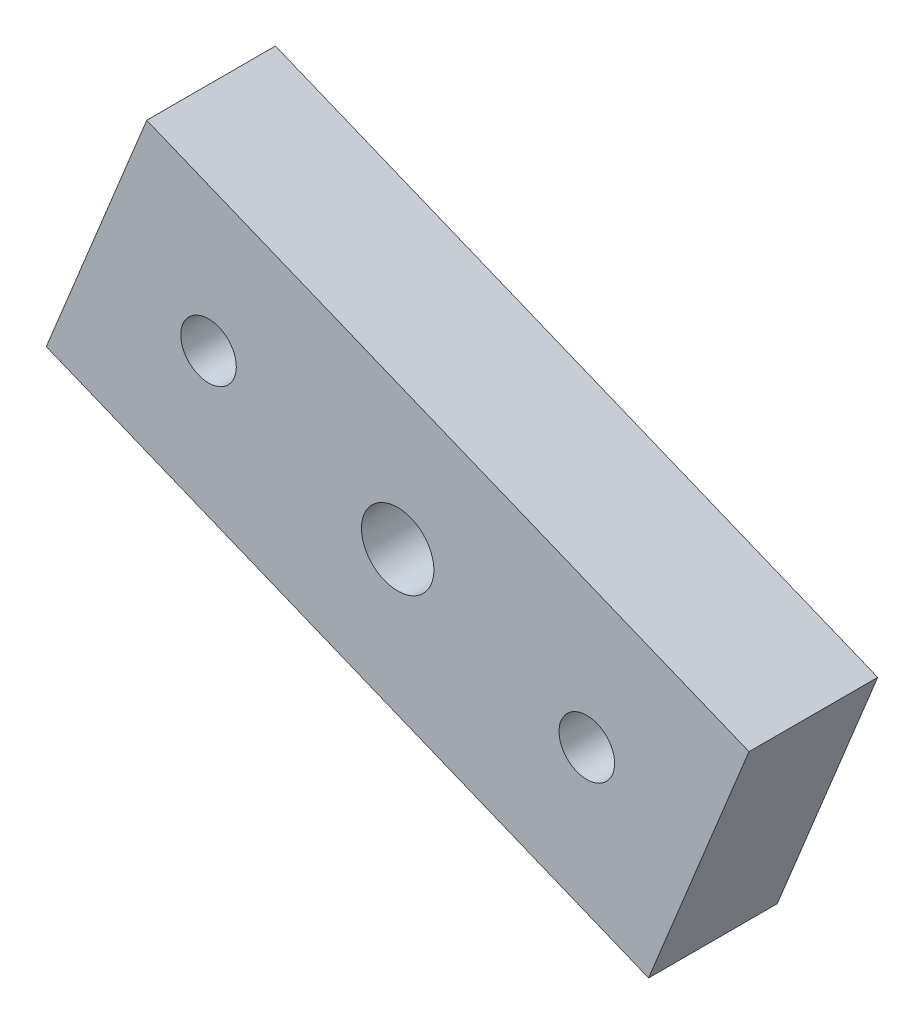
ISO-10303-21;
HEADER;
FILE_DESCRIPTION(('STEP AP214'),'2;1');
FILE_NAME('part.step','',(''),(''),'','','');
FILE_SCHEMA(('AUTOMOTIVE_DESIGN { 1 0 10303 214 1 1 1 1 }'));
ENDSEC;
DATA;
#1=APPLICATION_CONTEXT('core data for automotive mechanical design processes');
#2=APPLICATION_PROTOCOL_DEFINITION('international standard','automotive_design',2000,#1);
#3=PRODUCT_CONTEXT('',#1,'mechanical');
#4=PRODUCT('Part','Part','',(#3));
#5=PRODUCT_RELATED_PRODUCT_CATEGORY('part','',(#4));
#6=PRODUCT_DEFINITION_FORMATION('','',#4);
#7=PRODUCT_DEFINITION_CONTEXT('part definition',#1,'design');
#8=PRODUCT_DEFINITION('design','',#6,#7);
#9=PRODUCT_DEFINITION_SHAPE('','',#8);
#10=(LENGTH_UNIT() NAMED_UNIT(*) SI_UNIT(.MILLI.,.METRE.));
#11=(NAMED_UNIT(*) PLANE_ANGLE_UNIT() SI_UNIT($,.RADIAN.));
#12=(NAMED_UNIT(*) SI_UNIT($,.STERADIAN.) SOLID_ANGLE_UNIT());
#13=UNCERTAINTY_MEASURE_WITH_UNIT(LENGTH_MEASURE(1.E-05),#10,'distance_accuracy_value','');
#14=(GEOMETRIC_REPRESENTATION_CONTEXT(3) GLOBAL_UNCERTAINTY_ASSIGNED_CONTEXT((#13)) GLOBAL_UNIT_ASSIGNED_CONTEXT((#10,
#11,#12)) REPRESENTATION_CONTEXT('',''));
#15=CARTESIAN_POINT('',(0.,0.,0.));
#16=DIRECTION('',(0.,0.,1.));
#17=DIRECTION('',(1.,0.,0.));
#18=AXIS2_PLACEMENT_3D('',#15,#16,#17);
#19=CARTESIAN_POINT('',(0.,0.,-158.905642093371));
#20=DIRECTION('',(0.,0.,1.));
#21=DIRECTION('',(1.,0.,0.));
#22=AXIS2_PLACEMENT_3D('',#19,#20,#21);
#23=PLANE('',#22);
#24=DIRECTION('',(-0.377658189960762,-0.925945080204847,0.));
#25=VECTOR('',#24,1.);
#26=CARTESIAN_POINT('',(89.3687300635882,-36.4501454313466,-158.905642093371));
#27=LINE('',#26,#25);
#28=CARTESIAN_POINT('',(96.2582552651725,-19.5583577383082,-158.905642093371));
#29=VERTEX_POINT('',#28);
#30=CARTESIAN_POINT('',(90.0146140278719,-34.8665624586755,-158.905642093371));
#31=VERTEX_POINT('',#30);
#32=EDGE_CURVE('E78',#29,#31,#27,.T.);
#33=ORIENTED_EDGE('',*,*,#32,.F.);
#34=DIRECTION('',(0.925945080204847,-0.377658189960762,0.));
#35=VECTOR('',#34,1.);
#36=CARTESIAN_POINT('',(6.88952520158435,16.8917876930383,-158.905642093371));
#37=LINE('',#36,#35);
#38=CARTESIAN_POINT('',(58.8120120656851,-4.2854428215615,-158.905642093371));
#39=VERTEX_POINT('',#38);
#40=EDGE_CURVE('E67',#39,#29,#37,.T.);
#41=ORIENTED_EDGE('',*,*,#40,.F.);
#42=DIRECTION('',(-0.377658189960762,-0.925945080204847,0.));
#43=VECTOR('',#42,1.);
#44=CARTESIAN_POINT('',(51.9224868641007,-21.1772305145999,-158.905642093371));
#45=LINE('',#44,#43);
#46=CARTESIAN_POINT('',(52.5683708283844,-19.5936475419287,-158.905642093371));
#47=VERTEX_POINT('',#46);
#48=EDGE_CURVE('E74',#39,#47,#45,.T.);
#49=ORIENTED_EDGE('',*,*,#48,.T.);
#50=DIRECTION('',(0.925945080204847,-0.377658189960763,0.));
#51=VECTOR('',#50,1.);
#52=CARTESIAN_POINT('',(0.645883964283708,1.58358297267124,-158.905642093371));
#53=LINE('',#52,#51);
#54=EDGE_CURVE('E34',#47,#31,#53,.T.);
#55=ORIENTED_EDGE('',*,*,#54,.T.);
#56=EDGE_LOOP('',(#33,#41,#49,#55));
#57=FACE_BOUND('',#56,.T.);
#58=CARTESIAN_POINT('',(62.6538105281748,-14.7797436276181,-158.905642093371));
#59=DIRECTION('',(0.,0.,1.));
#60=DIRECTION('',(1.,0.,0.));
#61=AXIS2_PLACEMENT_3D('',#58,#59,#60);
#62=CIRCLE('',#61,1.7272);
#63=CARTESIAN_POINT('',(64.3810105281748,-14.7797436276181,-158.905642093371));
#64=VERTEX_POINT('',#63);
#65=EDGE_CURVE('E80',#64,#64,#62,.T.);
#66=ORIENTED_EDGE('',*,*,#65,.F.);
#67=EDGE_LOOP('',(#66));
#68=FACE_BOUND('',#67,.T.);
#69=CARTESIAN_POINT('',(86.1728155653814,-24.3722616526207,-158.905642093371));
#70=DIRECTION('',(0.,0.,1.));
#71=DIRECTION('',(1.,0.,0.));
#72=AXIS2_PLACEMENT_3D('',#69,#70,#71);
#73=CIRCLE('',#72,1.7272);
#74=CARTESIAN_POINT('',(87.9000155653814,-24.3722616526207,-158.905642093371));
#75=VERTEX_POINT('',#74);
#76=EDGE_CURVE('E98',#75,#75,#73,.T.);
#77=ORIENTED_EDGE('',*,*,#76,.F.);
#78=EDGE_LOOP('',(#77));
#79=FACE_BOUND('',#78,.T.);
#80=CARTESIAN_POINT('',(74.4133130467781,-19.5760026401194,-158.905642093371));
#81=DIRECTION('',(0.,0.,-1.));
#82=DIRECTION('',(-1.,0.,0.));
#83=AXIS2_PLACEMENT_3D('',#80,#81,#82);
#84=CIRCLE('',#83,2.25);
#85=CARTESIAN_POINT('',(72.1633130467781,-19.5760026401194,-158.905642093371));
#86=VERTEX_POINT('',#85);
#87=EDGE_CURVE('E89',#86,#86,#84,.T.);
#88=ORIENTED_EDGE('',*,*,#87,.T.);
#89=EDGE_LOOP('',(#88));
#90=FACE_BOUND('',#89,.T.);
#91=ADVANCED_FACE('F17',(#57,#68,#79,#90),#23,.T.);
#92=CARTESIAN_POINT('',(89.3687300635882,-36.4501454313466,-158.905642093371));
#93=DIRECTION('',(0.925945080204847,-0.377658189960762,0.));
#94=DIRECTION('',(0.377658189960762,0.925945080204847,0.));
#95=AXIS2_PLACEMENT_3D('',#92,#93,#94);
#96=PLANE('',#95);
#97=DIRECTION('',(-0.377658189960762,-0.925945080204847,0.));
#98=VECTOR('',#97,1.);
#99=CARTESIAN_POINT('',(89.3687300635882,-36.4501454313466,-166.90564209337));
#100=LINE('',#99,#98);
#101=CARTESIAN_POINT('',(96.2582552651725,-19.5583577383082,-166.90564209337));
#102=VERTEX_POINT('',#101);
#103=CARTESIAN_POINT('',(90.0146140278719,-34.8665624586755,-166.90564209337));
#104=VERTEX_POINT('',#103);
#105=EDGE_CURVE('E92',#102,#104,#100,.T.);
#106=ORIENTED_EDGE('',*,*,#105,.F.);
#107=DIRECTION('',(0.,0.,-1.));
#108=VECTOR('',#107,1.);
#109=CARTESIAN_POINT('',(96.2582552651725,-19.5583577383082,-158.905642093371));
#110=LINE('',#109,#108);
#111=EDGE_CURVE('E11',#29,#102,#110,.T.);
#112=ORIENTED_EDGE('',*,*,#111,.F.);
#113=ORIENTED_EDGE('',*,*,#32,.T.);
#114=DIRECTION('',(0.,0.,-1.));
#115=VECTOR('',#114,1.);
#116=CARTESIAN_POINT('',(90.0146140278719,-34.8665624586755,-158.905642093371));
#117=LINE('',#116,#115);
#118=EDGE_CURVE('E57',#31,#104,#117,.T.);
#119=ORIENTED_EDGE('',*,*,#118,.T.);
#120=EDGE_LOOP('',(#106,#112,#113,#119));
#121=FACE_BOUND('',#120,.T.);
#122=ADVANCED_FACE('F103',(#121),#96,.T.);
#123=CARTESIAN_POINT('',(6.88952520158435,16.8917876930383,-158.905642093371));
#124=DIRECTION('',(0.377658189960762,0.925945080204847,0.));
#125=DIRECTION('',(-0.925945080204847,0.377658189960762,0.));
#126=AXIS2_PLACEMENT_3D('',#123,#124,#125);
#127=PLANE('',#126);
#128=DIRECTION('',(0.925945080204847,-0.377658189960762,0.));
#129=VECTOR('',#128,1.);
#130=CARTESIAN_POINT('',(6.88952520158435,16.8917876930383,-166.90564209337));
#131=LINE('',#130,#129);
#132=CARTESIAN_POINT('',(58.8120120656851,-4.2854428215615,-166.90564209337));
#133=VERTEX_POINT('',#132);
#134=EDGE_CURVE('E69',#133,#102,#131,.T.);
#135=ORIENTED_EDGE('',*,*,#134,.F.);
#136=DIRECTION('',(0.,0.,-1.));
#137=VECTOR('',#136,1.);
#138=CARTESIAN_POINT('',(58.8120120656851,-4.2854428215615,-158.905642093371));
#139=LINE('',#138,#137);
#140=EDGE_CURVE('E26',#39,#133,#139,.T.);
#141=ORIENTED_EDGE('',*,*,#140,.F.);
#142=ORIENTED_EDGE('',*,*,#40,.T.);
#143=ORIENTED_EDGE('',*,*,#111,.T.);
#144=EDGE_LOOP('',(#135,#141,#142,#143));
#145=FACE_BOUND('',#144,.T.);
#146=ADVANCED_FACE('F65',(#145),#127,.T.);
#147=CARTESIAN_POINT('',(51.9224868641007,-21.1772305145999,-158.905642093371));
#148=DIRECTION('',(0.925945080204847,-0.377658189960762,0.));
#149=DIRECTION('',(0.377658189960762,0.925945080204847,0.));
#150=AXIS2_PLACEMENT_3D('',#147,#148,#149);
#151=PLANE('',#150);
#152=DIRECTION('',(-0.377658189960762,-0.925945080204847,0.));
#153=VECTOR('',#152,1.);
#154=CARTESIAN_POINT('',(51.9224868641007,-21.1772305145999,-166.90564209337));
#155=LINE('',#154,#153);
#156=CARTESIAN_POINT('',(52.5683708283844,-19.5936475419287,-166.90564209337));
#157=VERTEX_POINT('',#156);
#158=EDGE_CURVE('E95',#133,#157,#155,.T.);
#159=ORIENTED_EDGE('',*,*,#158,.T.);
#160=DIRECTION('',(0.,0.,-1.));
#161=VECTOR('',#160,1.);
#162=CARTESIAN_POINT('',(52.5683708283844,-19.5936475419287,-158.905642093371));
#163=LINE('',#162,#161);
#164=EDGE_CURVE('E72',#47,#157,#163,.T.);
#165=ORIENTED_EDGE('',*,*,#164,.F.);
#166=ORIENTED_EDGE('',*,*,#48,.F.);
#167=ORIENTED_EDGE('',*,*,#140,.T.);
#168=EDGE_LOOP('',(#159,#165,#166,#167));
#169=FACE_BOUND('',#168,.T.);
#170=ADVANCED_FACE('F75',(#169),#151,.F.);
#171=CARTESIAN_POINT('',(62.6538105281748,-14.7797436276181,-158.905642093371));
#172=DIRECTION('',(0.,0.,-1.));
#173=DIRECTION('',(-1.,0.,0.));
#174=AXIS2_PLACEMENT_3D('',#171,#172,#173);
#175=CYLINDRICAL_SURFACE('',#174,1.7272);
#176=ORIENTED_EDGE('',*,*,#65,.T.);
#177=EDGE_LOOP('',(#176));
#178=FACE_BOUND('',#177,.T.);
#179=CARTESIAN_POINT('',(62.6538105281748,-14.7797436276181,-166.90564209337));
#180=DIRECTION('',(0.,0.,1.));
#181=DIRECTION('',(1.,0.,0.));
#182=AXIS2_PLACEMENT_3D('',#179,#180,#181);
#183=CIRCLE('',#182,1.7272);
#184=CARTESIAN_POINT('',(64.3810105281748,-14.7797436276181,-166.90564209337));
#185=VERTEX_POINT('',#184);
#186=EDGE_CURVE('E88',#185,#185,#183,.T.);
#187=ORIENTED_EDGE('',*,*,#186,.F.);
#188=EDGE_LOOP('',(#187));
#189=FACE_BOUND('',#188,.T.);
#190=ADVANCED_FACE('F115',(#178,#189),#175,.F.);
#191=CARTESIAN_POINT('',(86.1728155653814,-24.3722616526207,-158.905642093371));
#192=DIRECTION('',(0.,0.,-1.));
#193=DIRECTION('',(-1.,0.,0.));
#194=AXIS2_PLACEMENT_3D('',#191,#192,#193);
#195=CYLINDRICAL_SURFACE('',#194,1.7272);
#196=ORIENTED_EDGE('',*,*,#76,.T.);
#197=EDGE_LOOP('',(#196));
#198=FACE_BOUND('',#197,.T.);
#199=CARTESIAN_POINT('',(86.1728155653814,-24.3722616526207,-166.90564209337));
#200=DIRECTION('',(0.,0.,1.));
#201=DIRECTION('',(1.,0.,0.));
#202=AXIS2_PLACEMENT_3D('',#199,#200,#201);
#203=CIRCLE('',#202,1.7272);
#204=CARTESIAN_POINT('',(87.9000155653814,-24.3722616526207,-166.90564209337));
#205=VERTEX_POINT('',#204);
#206=EDGE_CURVE('E85',#205,#205,#203,.T.);
#207=ORIENTED_EDGE('',*,*,#206,.F.);
#208=EDGE_LOOP('',(#207));
#209=FACE_BOUND('',#208,.T.);
#210=ADVANCED_FACE('F19',(#198,#209),#195,.F.);
#211=CARTESIAN_POINT('',(0.645883964283708,1.58358297267124,-158.905642093371));
#212=DIRECTION('',(0.377658189960763,0.925945080204847,0.));
#213=DIRECTION('',(-0.925945080204847,0.377658189960763,0.));
#214=AXIS2_PLACEMENT_3D('',#211,#212,#213);
#215=PLANE('',#214);
#216=DIRECTION('',(0.925945080204847,-0.377658189960763,0.));
#217=VECTOR('',#216,1.);
#218=CARTESIAN_POINT('',(0.645883964283708,1.58358297267124,-166.90564209337));
#219=LINE('',#218,#217);
#220=EDGE_CURVE('E50',#157,#104,#219,.T.);
#221=ORIENTED_EDGE('',*,*,#220,.T.);
#222=ORIENTED_EDGE('',*,*,#118,.F.);
#223=ORIENTED_EDGE('',*,*,#54,.F.);
#224=ORIENTED_EDGE('',*,*,#164,.T.);
#225=EDGE_LOOP('',(#221,#222,#223,#224));
#226=FACE_BOUND('',#225,.T.);
#227=ADVANCED_FACE('F101',(#226),#215,.F.);
#228=CARTESIAN_POINT('',(0.,0.,-166.90564209337));
#229=DIRECTION('',(0.,0.,1.));
#230=DIRECTION('',(1.,0.,0.));
#231=AXIS2_PLACEMENT_3D('',#228,#229,#230);
#232=PLANE('',#231);
#233=CARTESIAN_POINT('',(74.4133130467781,-19.5760026401194,-166.90564209337));
#234=DIRECTION('',(0.,0.,-1.));
#235=DIRECTION('',(-1.,0.,0.));
#236=AXIS2_PLACEMENT_3D('',#233,#234,#235);
#237=CIRCLE('',#236,4.);
#238=CARTESIAN_POINT('',(70.4133130467781,-19.5760026401194,-166.90564209337));
#239=VERTEX_POINT('',#238);
#240=EDGE_CURVE('E159',#239,#239,#237,.T.);
#241=ORIENTED_EDGE('',*,*,#240,.F.);
#242=EDGE_LOOP('',(#241));
#243=FACE_BOUND('',#242,.T.);
#244=ORIENTED_EDGE('',*,*,#206,.T.);
#245=EDGE_LOOP('',(#244));
#246=FACE_BOUND('',#245,.T.);
#247=ORIENTED_EDGE('',*,*,#186,.T.);
#248=EDGE_LOOP('',(#247));
#249=FACE_BOUND('',#248,.T.);
#250=ORIENTED_EDGE('',*,*,#105,.T.);
#251=ORIENTED_EDGE('',*,*,#220,.F.);
#252=ORIENTED_EDGE('',*,*,#158,.F.);
#253=ORIENTED_EDGE('',*,*,#134,.T.);
#254=EDGE_LOOP('',(#250,#251,#252,#253));
#255=FACE_BOUND('',#254,.T.);
#256=ADVANCED_FACE('F102',(#243,#246,#249,#255),#232,.F.);
#257=CARTESIAN_POINT('',(74.4133130467781,-19.5760026401194,-166.90564209337));
#258=DIRECTION('',(0.,0.,-1.));
#259=DIRECTION('',(-1.,0.,0.));
#260=AXIS2_PLACEMENT_3D('',#257,#258,#259);
#261=CYLINDRICAL_SURFACE('',#260,2.25);
#262=ORIENTED_EDGE('',*,*,#87,.F.);
#263=EDGE_LOOP('',(#262));
#264=FACE_BOUND('',#263,.T.);
#265=CARTESIAN_POINT('',(74.4133130467781,-19.5760026401194,-162.90564209337));
#266=DIRECTION('',(0.,0.,-1.));
#267=DIRECTION('',(-1.,0.,0.));
#268=AXIS2_PLACEMENT_3D('',#265,#266,#267);
#269=CIRCLE('',#268,2.25);
#270=CARTESIAN_POINT('',(72.1633130467781,-19.5760026401194,-162.90564209337));
#271=VERTEX_POINT('',#270);
#272=EDGE_CURVE('E161',#271,#271,#269,.T.);
#273=ORIENTED_EDGE('',*,*,#272,.T.);
#274=EDGE_LOOP('',(#273));
#275=FACE_BOUND('',#274,.T.);
#276=ADVANCED_FACE('F130',(#264,#275),#261,.F.);
#277=CARTESIAN_POINT('',(76.6633130467781,-19.5760026401194,-162.90564209337));
#278=DIRECTION('',(0.,0.,1.));
#279=DIRECTION('',(1.,0.,0.));
#280=AXIS2_PLACEMENT_3D('',#277,#278,#279);
#281=PLANE('',#280);
#282=ORIENTED_EDGE('',*,*,#272,.F.);
#283=EDGE_LOOP('',(#282));
#284=FACE_BOUND('',#283,.T.);
#285=CARTESIAN_POINT('',(74.4133130467781,-19.5760026401194,-162.90564209337));
#286=DIRECTION('',(0.,0.,-1.));
#287=DIRECTION('',(-1.,0.,0.));
#288=AXIS2_PLACEMENT_3D('',#285,#286,#287);
#289=CIRCLE('',#288,4.);
#290=CARTESIAN_POINT('',(70.4133130467781,-19.5760026401194,-162.90564209337));
#291=VERTEX_POINT('',#290);
#292=EDGE_CURVE('E157',#291,#291,#289,.T.);
#293=ORIENTED_EDGE('',*,*,#292,.T.);
#294=EDGE_LOOP('',(#293));
#295=FACE_BOUND('',#294,.T.);
#296=ADVANCED_FACE('F138',(#284,#295),#281,.F.);
#297=CARTESIAN_POINT('',(74.4133130467781,-19.5760026401194,-166.90564209337));
#298=DIRECTION('',(0.,0.,-1.));
#299=DIRECTION('',(-1.,0.,0.));
#300=AXIS2_PLACEMENT_3D('',#297,#298,#299);
#301=CYLINDRICAL_SURFACE('',#300,4.);
#302=ORIENTED_EDGE('',*,*,#292,.F.);
#303=EDGE_LOOP('',(#302));
#304=FACE_BOUND('',#303,.T.);
#305=ORIENTED_EDGE('',*,*,#240,.T.);
#306=EDGE_LOOP('',(#305));
#307=FACE_BOUND('',#306,.T.);
#308=ADVANCED_FACE('F147',(#304,#307),#301,.F.);
#309=CLOSED_SHELL('',(#91,#122,#146,#170,#190,#210,#227,#256,#276,#296,#308));
#310=MANIFOLD_SOLID_BREP('B1',#309);
#311=ADVANCED_BREP_SHAPE_REPRESENTATION('',(#18,#310),#14);
#312=SHAPE_DEFINITION_REPRESENTATION(#9,#311);
ENDSEC;
END-ISO-10303-21;
